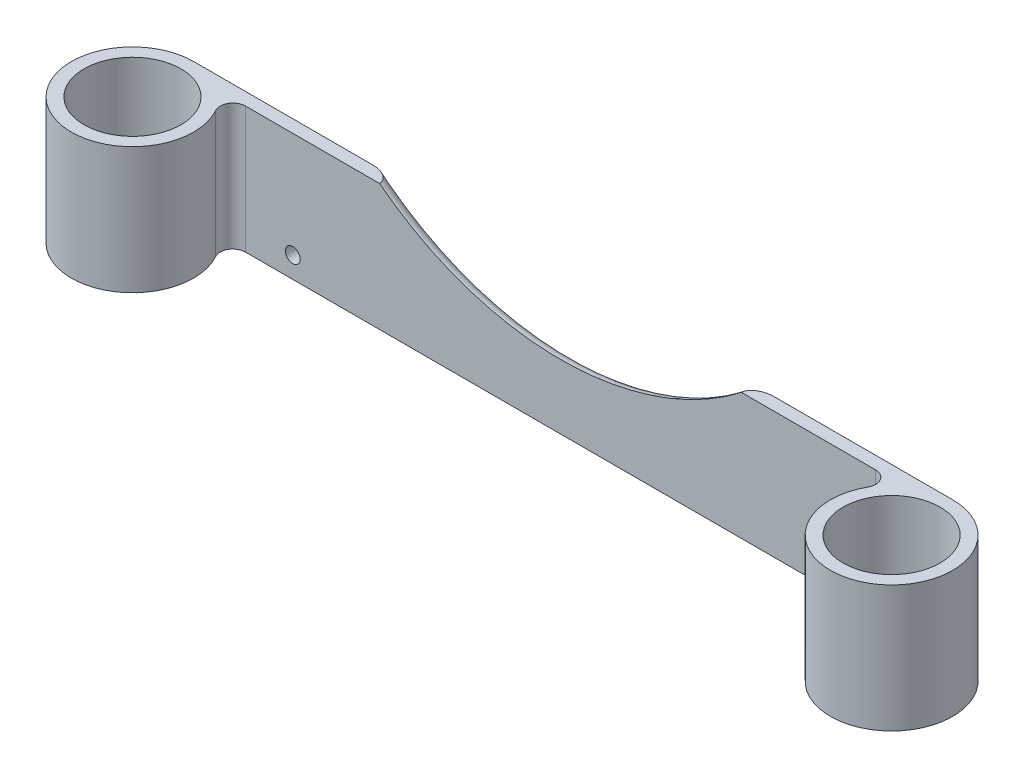
ISO-10303-21;
HEADER;
FILE_DESCRIPTION(('STEP AP214'),'2;1');
FILE_NAME('part.step','',(''),(''),'','','');
FILE_SCHEMA(('AUTOMOTIVE_DESIGN { 1 0 10303 214 1 1 1 1 }'));
ENDSEC;
DATA;
#1=APPLICATION_CONTEXT('core data for automotive mechanical design processes');
#2=APPLICATION_PROTOCOL_DEFINITION('international standard','automotive_design',2000,#1);
#3=PRODUCT_CONTEXT('',#1,'mechanical');
#4=PRODUCT('Part','Part','',(#3));
#5=PRODUCT_RELATED_PRODUCT_CATEGORY('part','',(#4));
#6=PRODUCT_DEFINITION_FORMATION('','',#4);
#7=PRODUCT_DEFINITION_CONTEXT('part definition',#1,'design');
#8=PRODUCT_DEFINITION('design','',#6,#7);
#9=PRODUCT_DEFINITION_SHAPE('','',#8);
#10=(LENGTH_UNIT() NAMED_UNIT(*) SI_UNIT(.MILLI.,.METRE.));
#11=(NAMED_UNIT(*) PLANE_ANGLE_UNIT() SI_UNIT($,.RADIAN.));
#12=(NAMED_UNIT(*) SI_UNIT($,.STERADIAN.) SOLID_ANGLE_UNIT());
#13=UNCERTAINTY_MEASURE_WITH_UNIT(LENGTH_MEASURE(1.E-05),#10,'distance_accuracy_value','');
#14=(GEOMETRIC_REPRESENTATION_CONTEXT(3) GLOBAL_UNCERTAINTY_ASSIGNED_CONTEXT((#13)) GLOBAL_UNIT_ASSIGNED_CONTEXT((#10,
#11,#12)) REPRESENTATION_CONTEXT('',''));
#15=CARTESIAN_POINT('',(0.,0.,0.));
#16=DIRECTION('',(0.,0.,1.));
#17=DIRECTION('',(1.,0.,0.));
#18=AXIS2_PLACEMENT_3D('',#15,#16,#17);
#19=CARTESIAN_POINT('',(0.,30.,0.));
#20=DIRECTION('',(0.,1.,0.));
#21=DIRECTION('',(0.,0.,1.));
#22=AXIS2_PLACEMENT_3D('',#19,#20,#21);
#23=PLANE('',#22);
#24=DIRECTION('',(-1.,0.,0.));
#25=VECTOR('',#24,1.);
#26=CARTESIAN_POINT('',(0.,30.,-14.5));
#27=LINE('',#26,#25);
#28=CARTESIAN_POINT('',(180.,30.,-14.5));
#29=VERTEX_POINT('',#28);
#30=CARTESIAN_POINT('',(137.638692588364,30.,-14.5));
#31=VERTEX_POINT('',#30);
#32=EDGE_CURVE('E105',#29,#31,#27,.T.);
#33=ORIENTED_EDGE('',*,*,#32,.T.);
#34=CARTESIAN_POINT('',(137.638692588364,30.,-14.5));
#35=CARTESIAN_POINT('',(137.540666040371,30.,-14.4999962874073));
#36=CARTESIAN_POINT('',(137.442651530532,30.,-14.4979541456344));
#37=CARTESIAN_POINT('',(137.246790435863,30.,-14.4898092064545));
#38=CARTESIAN_POINT('',(137.148943852527,30.,-14.4837063731266));
#39=CARTESIAN_POINT('',(136.855591358075,30.,-14.4593076558848));
#40=CARTESIAN_POINT('',(136.66055753453,30.,-14.4349216424835));
#41=CARTESIAN_POINT('',(136.27106880281,30.,-14.3693860406239));
#42=CARTESIAN_POINT('',(136.076644951647,30.,-14.3280514050405));
#43=CARTESIAN_POINT('',(135.692478369954,30.,-14.2280651552756));
#44=CARTESIAN_POINT('',(135.502731823076,30.,-14.1694282019505));
#45=CARTESIAN_POINT('',(135.091564874282,30.,-14.0198079721856));
#46=CARTESIAN_POINT('',(134.871603376013,30.,-13.9246619101375));
#47=CARTESIAN_POINT('',(134.553523803815,30.,-13.7599040710655));
#48=CARTESIAN_POINT('',(134.449589625228,30.,-13.7013933377243));
#49=CARTESIAN_POINT('',(134.246576847331,30.,-13.5765043240936));
#50=CARTESIAN_POINT('',(134.147496678261,30.,-13.5101286113548));
#51=CARTESIAN_POINT('',(133.916092541944,30.,-13.3400282916999));
#52=CARTESIAN_POINT('',(133.786767667623,30.,-13.2321390379328));
#53=CARTESIAN_POINT('',(133.545573853937,30.,-12.9981781260586));
#54=CARTESIAN_POINT('',(133.433684233475,30.,-12.8721283563759));
#55=CARTESIAN_POINT('',(133.261270603033,30.,-12.6371369540058));
#56=CARTESIAN_POINT('',(133.194982984183,30.,-12.5324552854784));
#57=CARTESIAN_POINT('',(133.080124928918,30.,-12.3139821409827));
#58=CARTESIAN_POINT('',(133.031500579789,30.,-12.2002197008451));
#59=CARTESIAN_POINT('',(132.963401978425,30.,-11.9892319694715));
#60=CARTESIAN_POINT('',(132.94003362087,30.,-11.8932770293703));
#61=CARTESIAN_POINT('',(132.916393192286,30.,-11.7472128633118));
#62=CARTESIAN_POINT('',(132.910414380982,30.,-11.697985598737));
#63=CARTESIAN_POINT('',(132.902416465276,30.,-11.5991790428088));
#64=CARTESIAN_POINT('',(132.900399935817,30.,-11.5495995435375));
#65=CARTESIAN_POINT('',(132.900408290931,30.,-11.5));
#66=B_SPLINE_CURVE_WITH_KNOTS('',3,(#34,#35,#36,#37,#38,#39,#40,#41,#42,#43,#44,#45,#46,#47,#48,
#49,#50,#51,#52,#53,#54,#55,#56,#57,#58,#59,#60,#61,#62,#63,#64,#65),.UNSPECIFIED.,.F.,.F.,(4,2,
2,2,2,2,2,2,2,2,2,2,2,2,2,4),(0.,0.294034834064486,0.588072269199286,1.17699898617045,
1.7725345405838,2.36756691898803,3.08429584077156,3.44182075732492,3.79922927849387,
4.30297905337061,4.80612667290267,5.17653140436984,5.54579587512584,5.84086093746773,
5.98948417040697,6.13820395629312),.UNSPECIFIED.);
#67=CARTESIAN_POINT('',(132.900408290931,30.,-11.5));
#68=VERTEX_POINT('',#67);
#69=EDGE_CURVE('E11',#31,#68,#66,.T.);
#70=ORIENTED_EDGE('',*,*,#69,.T.);
#71=DIRECTION('',(1.,0.,0.));
#72=VECTOR('',#71,1.);
#73=CARTESIAN_POINT('',(8.83176086632785,30.,-11.5));
#74=LINE('',#73,#72);
#75=CARTESIAN_POINT('',(164.702941459222,30.,-11.5));
#76=VERTEX_POINT('',#75);
#77=EDGE_CURVE('E103',#68,#76,#74,.T.);
#78=ORIENTED_EDGE('',*,*,#77,.T.);
#79=CARTESIAN_POINT('',(164.702941459222,30.,-8.5));
#80=DIRECTION('',(0.,1.,0.));
#81=DIRECTION('',(0.,0.,1.));
#82=AXIS2_PLACEMENT_3D('',#79,#80,#81);
#83=CIRCLE('',#82,3.);
#84=CARTESIAN_POINT('',(167.325294351926,30.,-7.04285714285714));
#85=VERTEX_POINT('',#84);
#86=EDGE_CURVE('E171',#76,#85,#83,.F.);
#87=ORIENTED_EDGE('',*,*,#86,.T.);
#88=CARTESIAN_POINT('',(180.,30.,0.));
#89=DIRECTION('',(0.,1.,0.));
#90=DIRECTION('',(0.,0.,1.));
#91=AXIS2_PLACEMENT_3D('',#88,#89,#90);
#92=CIRCLE('',#91,14.5);
#93=EDGE_CURVE('E143',#85,#29,#92,.T.);
#94=ORIENTED_EDGE('',*,*,#93,.T.);
#95=EDGE_LOOP('',(#33,#70,#78,#87,#94));
#96=FACE_BOUND('',#95,.T.);
#97=CARTESIAN_POINT('',(180.,30.,0.));
#98=DIRECTION('',(0.,1.,0.));
#99=DIRECTION('',(0.,0.,1.));
#100=AXIS2_PLACEMENT_3D('',#97,#98,#99);
#101=CIRCLE('',#100,11.5);
#102=CARTESIAN_POINT('',(180.,30.,11.5));
#103=VERTEX_POINT('',#102);
#104=EDGE_CURVE('E124',#103,#103,#101,.T.);
#105=ORIENTED_EDGE('',*,*,#104,.F.);
#106=EDGE_LOOP('',(#105));
#107=FACE_BOUND('',#106,.T.);
#108=ADVANCED_FACE('F33',(#96,#107),#23,.T.);
#109=CARTESIAN_POINT('',(15.2970585407784,30.,-11.5));
#110=VERTEX_POINT('',#109);
#111=CARTESIAN_POINT('',(47.0995917090686,30.,-11.5));
#112=VERTEX_POINT('',#111);
#113=EDGE_CURVE('E117',#110,#112,#74,.T.);
#114=ORIENTED_EDGE('',*,*,#113,.T.);
#115=CARTESIAN_POINT('',(47.0995917090686,30.,-11.5));
#116=CARTESIAN_POINT('',(47.0996237356798,30.,-11.5626750137609));
#117=CARTESIAN_POINT('',(47.0963881628392,30.,-11.6253310624436));
#118=CARTESIAN_POINT('',(47.0836305419393,30.,-11.7499235935468));
#119=CARTESIAN_POINT('',(47.0741163650001,30.,-11.8118608782377));
#120=CARTESIAN_POINT('',(47.0491952502653,30.,-11.9337792444764));
#121=CARTESIAN_POINT('',(47.0338583068621,30.,-11.9937747139033));
#122=CARTESIAN_POINT('',(46.9977048129526,30.,-12.1120845200809));
#123=CARTESIAN_POINT('',(46.9768869094866,30.,-12.1703984377963));
#124=CARTESIAN_POINT('',(46.9071509622811,30.,-12.3416615999337));
#125=CARTESIAN_POINT('',(46.8507966051669,30.,-12.4516428883318));
#126=CARTESIAN_POINT('',(46.7221920458837,30.,-12.6620678769244));
#127=CARTESIAN_POINT('',(46.6498909967751,30.,-12.7624795630395));
#128=CARTESIAN_POINT('',(46.4499869588283,30.,-13.0056902724194));
#129=CARTESIAN_POINT('',(46.3138323719538,30.,-13.1414463405366));
#130=CARTESIAN_POINT('',(46.0222246639223,30.,-13.3902439547839));
#131=CARTESIAN_POINT('',(45.8667293343379,30.,-13.5032343598304));
#132=CARTESIAN_POINT('',(45.5792415834199,30.,-13.685536666881));
#133=CARTESIAN_POINT('',(45.4498050122656,30.,-13.7589603707529));
#134=CARTESIAN_POINT('',(45.1850300138369,30.,-13.8943943270594));
#135=CARTESIAN_POINT('',(45.0496883330364,30.,-13.956398186744));
#136=CARTESIAN_POINT('',(44.7743654638931,30.,-14.0698127097406));
#137=CARTESIAN_POINT('',(44.63437580118,30.,-14.1212026333937));
#138=CARTESIAN_POINT('',(44.3510718704745,30.,-14.2138280574687));
#139=CARTESIAN_POINT('',(44.2077571454068,30.,-14.2550621526748));
#140=CARTESIAN_POINT('',(43.9237169591128,30.,-14.3265129728998));
#141=CARTESIAN_POINT('',(43.7830748202147,30.,-14.3570630215121));
#142=CARTESIAN_POINT('',(43.5001544291662,30.,-14.4093145700277));
#143=CARTESIAN_POINT('',(43.3578761014092,30.,-14.4310156593271));
#144=CARTESIAN_POINT('',(43.0734525887634,30.,-14.465548002229));
#145=CARTESIAN_POINT('',(42.9313161620097,30.,-14.478451615507));
#146=CARTESIAN_POINT('',(42.6465556416243,30.,-14.4956678116276));
#147=CARTESIAN_POINT('',(42.5039316641396,30.,-14.499982314753));
#148=CARTESIAN_POINT('',(42.3613074116363,30.,-14.5));
#149=B_SPLINE_CURVE_WITH_KNOTS('',3,(#115,#116,#117,#118,#119,#120,#121,#122,#123,#124,#125,
#126,#127,#128,#129,#130,#131,#132,#133,#134,#135,#136,#137,#138,#139,#140,#141,#142,#143,#144,
#145,#146,#147,#148),.UNSPECIFIED.,.F.,.F.,(4,2,2,2,2,2,2,2,2,2,2,2,2,2,2,2,4),(0.,
0.187911011907484,0.375586897107173,0.561074748663048,0.746608430379834,1.11552553491073,
1.48563641031812,2.0592073898238,2.63405282312586,3.07990443794206,3.5260048838261,
3.97296893217384,4.41999479020805,4.85147208966005,5.28296940798261,5.7108733801649,
6.1386816743336),.UNSPECIFIED.);
#150=CARTESIAN_POINT('',(42.3613074116363,30.,-14.5));
#151=VERTEX_POINT('',#150);
#152=EDGE_CURVE('E60',#112,#151,#149,.T.);
#153=ORIENTED_EDGE('',*,*,#152,.T.);
#154=CARTESIAN_POINT('',(0.,30.,-14.5));
#155=VERTEX_POINT('',#154);
#156=EDGE_CURVE('E145',#151,#155,#27,.T.);
#157=ORIENTED_EDGE('',*,*,#156,.T.);
#158=CARTESIAN_POINT('',(0.,30.,0.));
#159=DIRECTION('',(0.,1.,0.));
#160=DIRECTION('',(0.,0.,1.));
#161=AXIS2_PLACEMENT_3D('',#158,#159,#160);
#162=CIRCLE('',#161,14.5);
#163=CARTESIAN_POINT('',(12.6747056480735,30.,-7.04285714285714));
#164=VERTEX_POINT('',#163);
#165=EDGE_CURVE('E118',#155,#164,#162,.T.);
#166=ORIENTED_EDGE('',*,*,#165,.T.);
#167=CARTESIAN_POINT('',(15.2970585407784,30.,-8.5));
#168=DIRECTION('',(0.,1.,0.));
#169=DIRECTION('',(0.,0.,1.));
#170=AXIS2_PLACEMENT_3D('',#167,#168,#169);
#171=CIRCLE('',#170,3.);
#172=EDGE_CURVE('E175',#164,#110,#171,.F.);
#173=ORIENTED_EDGE('',*,*,#172,.T.);
#174=EDGE_LOOP('',(#114,#153,#157,#166,#173));
#175=FACE_BOUND('',#174,.T.);
#176=CARTESIAN_POINT('',(0.,30.,0.));
#177=DIRECTION('',(0.,1.,0.));
#178=DIRECTION('',(0.,0.,1.));
#179=AXIS2_PLACEMENT_3D('',#176,#177,#178);
#180=CIRCLE('',#179,11.5);
#181=CARTESIAN_POINT('',(0.,30.,11.5));
#182=VERTEX_POINT('',#181);
#183=EDGE_CURVE('E134',#182,#182,#180,.T.);
#184=ORIENTED_EDGE('',*,*,#183,.F.);
#185=EDGE_LOOP('',(#184));
#186=FACE_BOUND('',#185,.T.);
#187=ADVANCED_FACE('F180',(#175,#186),#23,.T.);
#188=CARTESIAN_POINT('',(0.,0.,0.));
#189=DIRECTION('',(0.,1.,0.));
#190=DIRECTION('',(0.,0.,1.));
#191=AXIS2_PLACEMENT_3D('',#188,#189,#190);
#192=PLANE('',#191);
#193=CARTESIAN_POINT('',(0.,0.,0.));
#194=DIRECTION('',(0.,1.,0.));
#195=DIRECTION('',(0.,0.,1.));
#196=AXIS2_PLACEMENT_3D('',#193,#194,#195);
#197=CIRCLE('',#196,14.5);
#198=CARTESIAN_POINT('',(0.,0.,-14.5));
#199=VERTEX_POINT('',#198);
#200=CARTESIAN_POINT('',(12.6747056480735,0.,-7.04285714285714));
#201=VERTEX_POINT('',#200);
#202=EDGE_CURVE('E137',#199,#201,#197,.T.);
#203=ORIENTED_EDGE('',*,*,#202,.F.);
#204=DIRECTION('',(-1.,0.,0.));
#205=VECTOR('',#204,1.);
#206=CARTESIAN_POINT('',(0.,0.,-14.5));
#207=LINE('',#206,#205);
#208=CARTESIAN_POINT('',(180.,0.,-14.5));
#209=VERTEX_POINT('',#208);
#210=EDGE_CURVE('E141',#209,#199,#207,.T.);
#211=ORIENTED_EDGE('',*,*,#210,.F.);
#212=CARTESIAN_POINT('',(180.,0.,0.));
#213=DIRECTION('',(0.,1.,0.));
#214=DIRECTION('',(0.,0.,1.));
#215=AXIS2_PLACEMENT_3D('',#212,#213,#214);
#216=CIRCLE('',#215,14.5);
#217=CARTESIAN_POINT('',(167.325294351926,0.,-7.04285714285714));
#218=VERTEX_POINT('',#217);
#219=EDGE_CURVE('E152',#218,#209,#216,.T.);
#220=ORIENTED_EDGE('',*,*,#219,.F.);
#221=CARTESIAN_POINT('',(164.702941459222,0.,-8.5));
#222=DIRECTION('',(0.,1.,0.));
#223=DIRECTION('',(0.,0.,1.));
#224=AXIS2_PLACEMENT_3D('',#221,#222,#223);
#225=CIRCLE('',#224,3.);
#226=CARTESIAN_POINT('',(164.702941459222,0.,-11.5));
#227=VERTEX_POINT('',#226);
#228=EDGE_CURVE('E169',#218,#227,#225,.T.);
#229=ORIENTED_EDGE('',*,*,#228,.T.);
#230=DIRECTION('',(1.,0.,0.));
#231=VECTOR('',#230,1.);
#232=CARTESIAN_POINT('',(8.83176086632785,0.,-11.5));
#233=LINE('',#232,#231);
#234=CARTESIAN_POINT('',(15.2970585407784,0.,-11.5));
#235=VERTEX_POINT('',#234);
#236=EDGE_CURVE('E150',#235,#227,#233,.T.);
#237=ORIENTED_EDGE('',*,*,#236,.F.);
#238=CARTESIAN_POINT('',(15.2970585407784,0.,-8.5));
#239=DIRECTION('',(0.,1.,0.));
#240=DIRECTION('',(0.,0.,1.));
#241=AXIS2_PLACEMENT_3D('',#238,#239,#240);
#242=CIRCLE('',#241,3.);
#243=EDGE_CURVE('E173',#235,#201,#242,.T.);
#244=ORIENTED_EDGE('',*,*,#243,.T.);
#245=EDGE_LOOP('',(#203,#211,#220,#229,#237,#244));
#246=FACE_BOUND('',#245,.T.);
#247=CARTESIAN_POINT('',(0.,0.,0.));
#248=DIRECTION('',(0.,1.,0.));
#249=DIRECTION('',(0.,0.,1.));
#250=AXIS2_PLACEMENT_3D('',#247,#248,#249);
#251=CIRCLE('',#250,11.5);
#252=CARTESIAN_POINT('',(0.,0.,11.5));
#253=VERTEX_POINT('',#252);
#254=EDGE_CURVE('E132',#253,#253,#251,.T.);
#255=ORIENTED_EDGE('',*,*,#254,.T.);
#256=EDGE_LOOP('',(#255));
#257=FACE_BOUND('',#256,.T.);
#258=CARTESIAN_POINT('',(180.,0.,0.));
#259=DIRECTION('',(0.,1.,0.));
#260=DIRECTION('',(0.,0.,1.));
#261=AXIS2_PLACEMENT_3D('',#258,#259,#260);
#262=CIRCLE('',#261,11.5);
#263=CARTESIAN_POINT('',(180.,0.,11.5));
#264=VERTEX_POINT('',#263);
#265=EDGE_CURVE('E120',#264,#264,#262,.T.);
#266=ORIENTED_EDGE('',*,*,#265,.T.);
#267=EDGE_LOOP('',(#266));
#268=FACE_BOUND('',#267,.T.);
#269=ADVANCED_FACE('F185',(#246,#257,#268),#192,.F.);
#270=CARTESIAN_POINT('',(0.,30.,0.));
#271=DIRECTION('',(0.,-1.,0.));
#272=DIRECTION('',(0.,0.,-1.));
#273=AXIS2_PLACEMENT_3D('',#270,#271,#272);
#274=CYLINDRICAL_SURFACE('',#273,14.5);
#275=ORIENTED_EDGE('',*,*,#202,.T.);
#276=DIRECTION('',(0.,-1.,0.));
#277=VECTOR('',#276,1.);
#278=CARTESIAN_POINT('',(12.6747056480735,30.,-7.04285714285714));
#279=LINE('',#278,#277);
#280=EDGE_CURVE('E167',#201,#164,#279,.F.);
#281=ORIENTED_EDGE('',*,*,#280,.T.);
#282=ORIENTED_EDGE('',*,*,#165,.F.);
#283=DIRECTION('',(0.,-1.,0.));
#284=VECTOR('',#283,1.);
#285=CARTESIAN_POINT('',(0.,30.,-14.5));
#286=LINE('',#285,#284);
#287=EDGE_CURVE('E147',#155,#199,#286,.T.);
#288=ORIENTED_EDGE('',*,*,#287,.T.);
#289=EDGE_LOOP('',(#275,#281,#282,#288));
#290=FACE_BOUND('',#289,.T.);
#291=ADVANCED_FACE('F191',(#290),#274,.T.);
#292=CARTESIAN_POINT('',(8.83176086632785,30.,-11.5));
#293=DIRECTION('',(0.,0.,-1.));
#294=DIRECTION('',(-1.,0.,0.));
#295=AXIS2_PLACEMENT_3D('',#292,#293,#294);
#296=PLANE('',#295);
#297=CARTESIAN_POINT('',(26.5,5.00000000000003,-11.5));
#298=DIRECTION('',(0.,0.,-1.));
#299=DIRECTION('',(-1.,0.,0.));
#300=AXIS2_PLACEMENT_3D('',#297,#298,#299);
#301=CIRCLE('',#300,1.75);
#302=CARTESIAN_POINT('',(24.75,5.00000000000003,-11.5));
#303=VERTEX_POINT('',#302);
#304=EDGE_CURVE('E121',#303,#303,#301,.T.);
#305=ORIENTED_EDGE('',*,*,#304,.T.);
#306=EDGE_LOOP('',(#305));
#307=FACE_BOUND('',#306,.T.);
#308=CARTESIAN_POINT('',(153.5,5.,-11.5));
#309=DIRECTION('',(0.,0.,-1.));
#310=DIRECTION('',(-1.,0.,0.));
#311=AXIS2_PLACEMENT_3D('',#308,#309,#310);
#312=CIRCLE('',#311,1.75000000000001);
#313=CARTESIAN_POINT('',(151.75,5.,-11.5));
#314=VERTEX_POINT('',#313);
#315=EDGE_CURVE('E127',#314,#314,#312,.T.);
#316=ORIENTED_EDGE('',*,*,#315,.T.);
#317=EDGE_LOOP('',(#316));
#318=FACE_BOUND('',#317,.T.);
#319=ORIENTED_EDGE('',*,*,#77,.F.);
#320=CARTESIAN_POINT('',(90.,85.3132440602735,-11.5));
#321=DIRECTION('',(0.,0.,-1.));
#322=DIRECTION('',(-1.,0.,0.));
#323=AXIS2_PLACEMENT_3D('',#320,#321,#322);
#324=CIRCLE('',#323,70.);
#325=EDGE_CURVE('E112',#68,#112,#324,.T.);
#326=ORIENTED_EDGE('',*,*,#325,.T.);
#327=ORIENTED_EDGE('',*,*,#113,.F.);
#328=DIRECTION('',(0.,1.,0.));
#329=VECTOR('',#328,1.);
#330=CARTESIAN_POINT('',(15.2970585407784,0.,-11.5));
#331=LINE('',#330,#329);
#332=EDGE_CURVE('E163',#110,#235,#331,.F.);
#333=ORIENTED_EDGE('',*,*,#332,.T.);
#334=ORIENTED_EDGE('',*,*,#236,.T.);
#335=DIRECTION('',(0.,1.,0.));
#336=VECTOR('',#335,1.);
#337=CARTESIAN_POINT('',(164.702941459222,30.,-11.5));
#338=LINE('',#337,#336);
#339=EDGE_CURVE('E115',#227,#76,#338,.T.);
#340=ORIENTED_EDGE('',*,*,#339,.T.);
#341=EDGE_LOOP('',(#319,#326,#327,#333,#334,#340));
#342=FACE_BOUND('',#341,.T.);
#343=ADVANCED_FACE('F110',(#307,#318,#342),#296,.F.);
#344=CARTESIAN_POINT('',(180.,30.,0.));
#345=DIRECTION('',(0.,-1.,0.));
#346=DIRECTION('',(0.,0.,-1.));
#347=AXIS2_PLACEMENT_3D('',#344,#345,#346);
#348=CYLINDRICAL_SURFACE('',#347,14.5);
#349=ORIENTED_EDGE('',*,*,#93,.F.);
#350=DIRECTION('',(0.,-1.,0.));
#351=VECTOR('',#350,1.);
#352=CARTESIAN_POINT('',(167.325294351926,30.,-7.04285714285715));
#353=LINE('',#352,#351);
#354=EDGE_CURVE('E160',#85,#218,#353,.T.);
#355=ORIENTED_EDGE('',*,*,#354,.T.);
#356=ORIENTED_EDGE('',*,*,#219,.T.);
#357=DIRECTION('',(0.,-1.,0.));
#358=VECTOR('',#357,1.);
#359=CARTESIAN_POINT('',(180.,30.,-14.5));
#360=LINE('',#359,#358);
#361=EDGE_CURVE('E157',#29,#209,#360,.T.);
#362=ORIENTED_EDGE('',*,*,#361,.F.);
#363=EDGE_LOOP('',(#349,#355,#356,#362));
#364=FACE_BOUND('',#363,.T.);
#365=ADVANCED_FACE('F196',(#364),#348,.T.);
#366=CARTESIAN_POINT('',(0.,30.,-14.5));
#367=DIRECTION('',(0.,0.,1.));
#368=DIRECTION('',(1.,0.,0.));
#369=AXIS2_PLACEMENT_3D('',#366,#367,#368);
#370=PLANE('',#369);
#371=CARTESIAN_POINT('',(26.5,5.00000000000003,-14.5));
#372=DIRECTION('',(0.,0.,-1.));
#373=DIRECTION('',(-1.,0.,0.));
#374=AXIS2_PLACEMENT_3D('',#371,#372,#373);
#375=CIRCLE('',#374,1.75);
#376=CARTESIAN_POINT('',(24.75,5.00000000000003,-14.5));
#377=VERTEX_POINT('',#376);
#378=EDGE_CURVE('E298',#377,#377,#375,.T.);
#379=ORIENTED_EDGE('',*,*,#378,.F.);
#380=EDGE_LOOP('',(#379));
#381=FACE_BOUND('',#380,.T.);
#382=CARTESIAN_POINT('',(153.5,5.,-14.5));
#383=DIRECTION('',(0.,0.,-1.));
#384=DIRECTION('',(-1.,0.,0.));
#385=AXIS2_PLACEMENT_3D('',#382,#383,#384);
#386=CIRCLE('',#385,1.75000000000001);
#387=CARTESIAN_POINT('',(151.75,5.,-14.5));
#388=VERTEX_POINT('',#387);
#389=EDGE_CURVE('E304',#388,#388,#386,.T.);
#390=ORIENTED_EDGE('',*,*,#389,.F.);
#391=EDGE_LOOP('',(#390));
#392=FACE_BOUND('',#391,.T.);
#393=ORIENTED_EDGE('',*,*,#156,.F.);
#394=CARTESIAN_POINT('',(90.,85.3132440602735,-14.5));
#395=DIRECTION('',(0.,0.,1.));
#396=DIRECTION('',(1.,0.,0.));
#397=AXIS2_PLACEMENT_3D('',#394,#395,#396);
#398=CIRCLE('',#397,73.);
#399=EDGE_CURVE('E46',#151,#31,#398,.T.);
#400=ORIENTED_EDGE('',*,*,#399,.T.);
#401=ORIENTED_EDGE('',*,*,#32,.F.);
#402=ORIENTED_EDGE('',*,*,#361,.T.);
#403=ORIENTED_EDGE('',*,*,#210,.T.);
#404=ORIENTED_EDGE('',*,*,#287,.F.);
#405=EDGE_LOOP('',(#393,#400,#401,#402,#403,#404));
#406=FACE_BOUND('',#405,.T.);
#407=ADVANCED_FACE('F193',(#381,#392,#406),#370,.F.);
#408=CARTESIAN_POINT('',(0.,30.,0.));
#409=DIRECTION('',(0.,-1.,0.));
#410=DIRECTION('',(0.,0.,-1.));
#411=AXIS2_PLACEMENT_3D('',#408,#409,#410);
#412=CYLINDRICAL_SURFACE('',#411,11.5);
#413=ORIENTED_EDGE('',*,*,#183,.T.);
#414=EDGE_LOOP('',(#413));
#415=FACE_BOUND('',#414,.T.);
#416=ORIENTED_EDGE('',*,*,#254,.F.);
#417=EDGE_LOOP('',(#416));
#418=FACE_BOUND('',#417,.T.);
#419=ADVANCED_FACE('F186',(#415,#418),#412,.F.);
#420=CARTESIAN_POINT('',(180.,30.,0.));
#421=DIRECTION('',(0.,-1.,0.));
#422=DIRECTION('',(0.,0.,-1.));
#423=AXIS2_PLACEMENT_3D('',#420,#421,#422);
#424=CYLINDRICAL_SURFACE('',#423,11.5);
#425=ORIENTED_EDGE('',*,*,#104,.T.);
#426=EDGE_LOOP('',(#425));
#427=FACE_BOUND('',#426,.T.);
#428=ORIENTED_EDGE('',*,*,#265,.F.);
#429=EDGE_LOOP('',(#428));
#430=FACE_BOUND('',#429,.T.);
#431=ADVANCED_FACE('F210',(#427,#430),#424,.F.);
#432=CARTESIAN_POINT('',(164.702941459222,30.,-8.5));
#433=DIRECTION('',(0.,-1.,0.));
#434=DIRECTION('',(0.,0.,-1.));
#435=AXIS2_PLACEMENT_3D('',#432,#433,#434);
#436=CYLINDRICAL_SURFACE('',#435,3.);
#437=ORIENTED_EDGE('',*,*,#86,.F.);
#438=ORIENTED_EDGE('',*,*,#339,.F.);
#439=ORIENTED_EDGE('',*,*,#228,.F.);
#440=ORIENTED_EDGE('',*,*,#354,.F.);
#441=EDGE_LOOP('',(#437,#438,#439,#440));
#442=FACE_BOUND('',#441,.T.);
#443=ADVANCED_FACE('F207',(#442),#436,.F.);
#444=CARTESIAN_POINT('',(15.2970585407784,30.,-8.5));
#445=DIRECTION('',(0.,-1.,0.));
#446=DIRECTION('',(0.,0.,-1.));
#447=AXIS2_PLACEMENT_3D('',#444,#445,#446);
#448=CYLINDRICAL_SURFACE('',#447,3.);
#449=ORIENTED_EDGE('',*,*,#172,.F.);
#450=ORIENTED_EDGE('',*,*,#280,.F.);
#451=ORIENTED_EDGE('',*,*,#243,.F.);
#452=ORIENTED_EDGE('',*,*,#332,.F.);
#453=EDGE_LOOP('',(#449,#450,#451,#452));
#454=FACE_BOUND('',#453,.T.);
#455=ADVANCED_FACE('F209',(#454),#448,.F.);
#456=CARTESIAN_POINT('',(153.5,5.,15.5));
#457=DIRECTION('',(0.,0.,-1.));
#458=DIRECTION('',(-1.,0.,0.));
#459=AXIS2_PLACEMENT_3D('',#456,#457,#458);
#460=CYLINDRICAL_SURFACE('',#459,1.75000000000001);
#461=ORIENTED_EDGE('',*,*,#389,.T.);
#462=EDGE_LOOP('',(#461));
#463=FACE_BOUND('',#462,.T.);
#464=ORIENTED_EDGE('',*,*,#315,.F.);
#465=EDGE_LOOP('',(#464));
#466=FACE_BOUND('',#465,.T.);
#467=ADVANCED_FACE('F213',(#463,#466),#460,.F.);
#468=CARTESIAN_POINT('',(26.5,5.00000000000003,15.5));
#469=DIRECTION('',(0.,0.,-1.));
#470=DIRECTION('',(-1.,0.,0.));
#471=AXIS2_PLACEMENT_3D('',#468,#469,#470);
#472=CYLINDRICAL_SURFACE('',#471,1.75);
#473=ORIENTED_EDGE('',*,*,#378,.T.);
#474=EDGE_LOOP('',(#473));
#475=FACE_BOUND('',#474,.T.);
#476=ORIENTED_EDGE('',*,*,#304,.F.);
#477=EDGE_LOOP('',(#476));
#478=FACE_BOUND('',#477,.T.);
#479=ADVANCED_FACE('F218',(#475,#478),#472,.F.);
#480=CARTESIAN_POINT('',(90.,85.3132440602735,-11.5));
#481=DIRECTION('',(0.,0.,1.));
#482=DIRECTION('',(1.,0.,0.));
#483=AXIS2_PLACEMENT_3D('',#480,#481,#482);
#484=TOROIDAL_SURFACE('',#483,73.,3.);
#485=ORIENTED_EDGE('',*,*,#69,.F.);
#486=ORIENTED_EDGE('',*,*,#399,.F.);
#487=ORIENTED_EDGE('',*,*,#152,.F.);
#488=ORIENTED_EDGE('',*,*,#325,.F.);
#489=EDGE_LOOP('',(#485,#486,#487,#488));
#490=FACE_BOUND('',#489,.T.);
#491=ADVANCED_FACE('F35',(#490),#484,.T.);
#492=CLOSED_SHELL('',(#108,#187,#269,#291,#343,#365,#407,#419,#431,#443,#455,#467,#479,#491));
#493=MANIFOLD_SOLID_BREP('B2',#492);
#494=ADVANCED_BREP_SHAPE_REPRESENTATION('',(#18,#493),#14);
#495=SHAPE_DEFINITION_REPRESENTATION(#9,#494);
ENDSEC;
END-ISO-10303-21;
